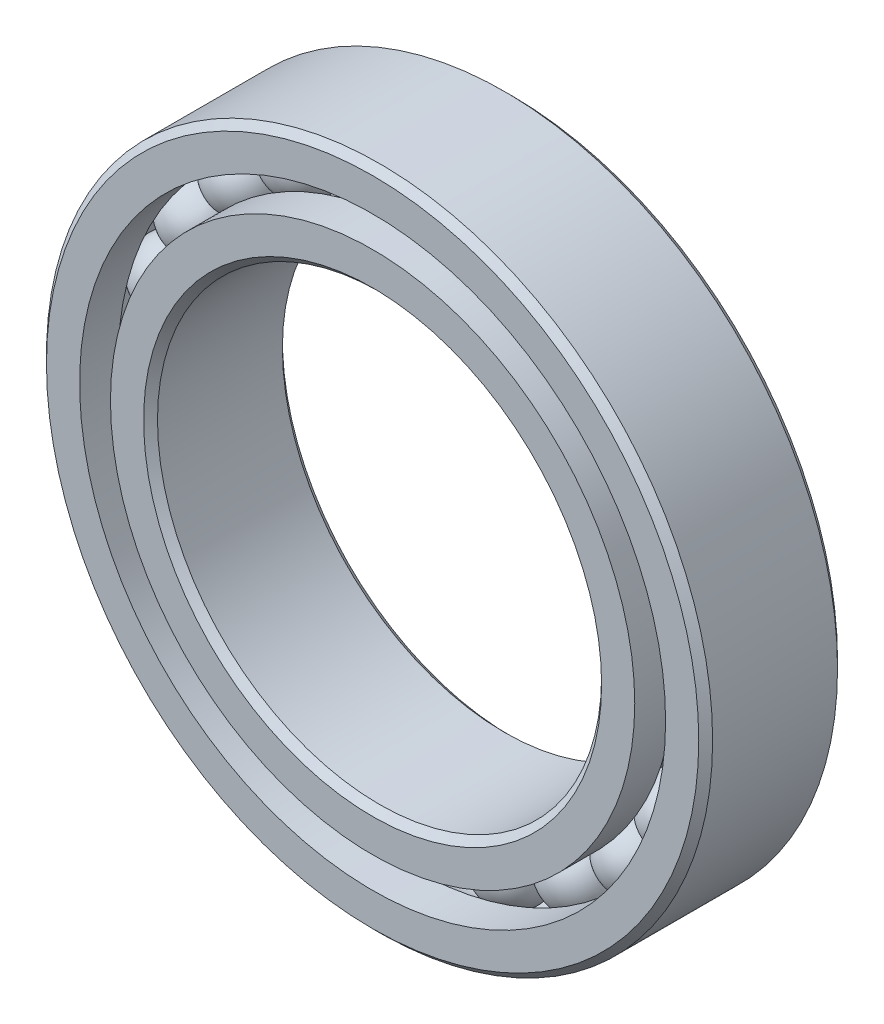
ISO-10303-21;
HEADER;
FILE_DESCRIPTION(('STEP AP214'),'2;1');
FILE_NAME('part.step','',(''),(''),'','','');
FILE_SCHEMA(('AUTOMOTIVE_DESIGN { 1 0 10303 214 1 1 1 1 }'));
ENDSEC;
DATA;
#1=APPLICATION_CONTEXT('core data for automotive mechanical design processes');
#2=APPLICATION_PROTOCOL_DEFINITION('international standard','automotive_design',2000,#1);
#3=PRODUCT_CONTEXT('',#1,'mechanical');
#4=PRODUCT('Part','Part','',(#3));
#5=PRODUCT_RELATED_PRODUCT_CATEGORY('part','',(#4));
#6=PRODUCT_DEFINITION_FORMATION('','',#4);
#7=PRODUCT_DEFINITION_CONTEXT('part definition',#1,'design');
#8=PRODUCT_DEFINITION('design','',#6,#7);
#9=PRODUCT_DEFINITION_SHAPE('','',#8);
#10=(LENGTH_UNIT() NAMED_UNIT(*) SI_UNIT(.MILLI.,.METRE.));
#11=(NAMED_UNIT(*) PLANE_ANGLE_UNIT() SI_UNIT($,.RADIAN.));
#12=(NAMED_UNIT(*) SI_UNIT($,.STERADIAN.) SOLID_ANGLE_UNIT());
#13=UNCERTAINTY_MEASURE_WITH_UNIT(LENGTH_MEASURE(1.E-05),#10,'distance_accuracy_value','');
#14=(GEOMETRIC_REPRESENTATION_CONTEXT(3) GLOBAL_UNCERTAINTY_ASSIGNED_CONTEXT((#13)) GLOBAL_UNIT_ASSIGNED_CONTEXT((#10,
#11,#12)) REPRESENTATION_CONTEXT('',''));
#15=CARTESIAN_POINT('',(0.,0.,0.));
#16=DIRECTION('',(0.,0.,1.));
#17=DIRECTION('',(1.,0.,0.));
#18=AXIS2_PLACEMENT_3D('',#15,#16,#17);
#19=CARTESIAN_POINT('',(-1.29409522551254,4.82962913144536,0.));
#20=DIRECTION('',(0.,0.,1.));
#21=DIRECTION('',(-0.258819045102508,0.965925826289072,0.));
#22=AXIS2_PLACEMENT_3D('',#19,#20,#21);
#23=SPHERICAL_SURFACE('',#22,0.621129993749942);
#24=CARTESIAN_POINT('',(-1.29409522551254,4.82962913144536,0.621129993749943));
#25=VERTEX_POINT('',#24);
#26=VERTEX_LOOP('',#25);
#27=FACE_BOUND('',#26,.T.);
#28=ADVANCED_FACE('F42',(#27),#23,.T.);
#29=CLOSED_SHELL('',(#28));
#30=MANIFOLD_SOLID_BREP('B2',#29);
#31=CARTESIAN_POINT('',(-2.49999999999994,4.33012701892223,0.));
#32=DIRECTION('',(0.,0.,1.));
#33=DIRECTION('',(-0.499999999999989,0.866025403784445,0.));
#34=AXIS2_PLACEMENT_3D('',#31,#32,#33);
#35=SPHERICAL_SURFACE('',#34,0.621129993749942);
#36=CARTESIAN_POINT('',(-2.49999999999994,4.33012701892223,0.621129993749943));
#37=VERTEX_POINT('',#36);
#38=VERTEX_LOOP('',#37);
#39=FACE_BOUND('',#38,.T.);
#40=ADVANCED_FACE('F59',(#39),#35,.T.);
#41=CLOSED_SHELL('',(#40));
#42=MANIFOLD_SOLID_BREP('B6',#41);
#43=CARTESIAN_POINT('',(-3.53553390593269,3.53553390593278,0.));
#44=DIRECTION('',(0.,0.,1.));
#45=DIRECTION('',(-0.707106781186539,0.707106781186556,0.));
#46=AXIS2_PLACEMENT_3D('',#43,#44,#45);
#47=SPHERICAL_SURFACE('',#46,0.621129993749942);
#48=CARTESIAN_POINT('',(-3.53553390593269,3.53553390593278,0.621129993749943));
#49=VERTEX_POINT('',#48);
#50=VERTEX_LOOP('',#49);
#51=FACE_BOUND('',#50,.T.);
#52=ADVANCED_FACE('F76',(#51),#47,.T.);
#53=CLOSED_SHELL('',(#52));
#54=MANIFOLD_SOLID_BREP('B38',#53);
#55=CARTESIAN_POINT('',(-4.33012701892216,2.50000000000005,0.));
#56=DIRECTION('',(0.,0.,1.));
#57=DIRECTION('',(-0.866025403784433,0.50000000000001,0.));
#58=AXIS2_PLACEMENT_3D('',#55,#56,#57);
#59=SPHERICAL_SURFACE('',#58,0.621129993749942);
#60=CARTESIAN_POINT('',(-4.33012701892216,2.50000000000005,0.621129993749943));
#61=VERTEX_POINT('',#60);
#62=VERTEX_LOOP('',#61);
#63=FACE_BOUND('',#62,.T.);
#64=ADVANCED_FACE('F93',(#63),#59,.T.);
#65=CLOSED_SHELL('',(#64));
#66=MANIFOLD_SOLID_BREP('B55',#65);
#67=CARTESIAN_POINT('',(-4.82962913144533,1.29409522551266,0.));
#68=DIRECTION('',(0.,0.,1.));
#69=DIRECTION('',(-0.965925826289065,0.258819045102531,0.));
#70=AXIS2_PLACEMENT_3D('',#67,#68,#69);
#71=SPHERICAL_SURFACE('',#70,0.621129993749942);
#72=CARTESIAN_POINT('',(-4.82962913144533,1.29409522551266,0.621129993749943));
#73=VERTEX_POINT('',#72);
#74=VERTEX_LOOP('',#73);
#75=FACE_BOUND('',#74,.T.);
#76=ADVANCED_FACE('F110',(#75),#71,.T.);
#77=CLOSED_SHELL('',(#76));
#78=MANIFOLD_SOLID_BREP('B72',#77);
#79=CARTESIAN_POINT('',(-5.,0.,0.));
#80=DIRECTION('',(0.,0.,1.));
#81=DIRECTION('',(-1.,0.,0.));
#82=AXIS2_PLACEMENT_3D('',#79,#80,#81);
#83=SPHERICAL_SURFACE('',#82,0.621129993749942);
#84=CARTESIAN_POINT('',(-5.,0.,0.621129993749943));
#85=VERTEX_POINT('',#84);
#86=VERTEX_LOOP('',#85);
#87=FACE_BOUND('',#86,.T.);
#88=ADVANCED_FACE('F127',(#87),#83,.T.);
#89=CLOSED_SHELL('',(#88));
#90=MANIFOLD_SOLID_BREP('B89',#89);
#91=CARTESIAN_POINT('',(-4.82962913144535,-1.29409522551256,0.));
#92=DIRECTION('',(0.,0.,1.));
#93=DIRECTION('',(-0.965925826289071,-0.258819045102511,0.));
#94=AXIS2_PLACEMENT_3D('',#91,#92,#93);
#95=SPHERICAL_SURFACE('',#94,0.621129993749942);
#96=CARTESIAN_POINT('',(-4.82962913144535,-1.29409522551256,0.621129993749943));
#97=VERTEX_POINT('',#96);
#98=VERTEX_LOOP('',#97);
#99=FACE_BOUND('',#98,.T.);
#100=ADVANCED_FACE('F144',(#99),#95,.T.);
#101=CLOSED_SHELL('',(#100));
#102=MANIFOLD_SOLID_BREP('B106',#101);
#103=CARTESIAN_POINT('',(-4.33012701892222,-2.49999999999996,0.));
#104=DIRECTION('',(0.,0.,1.));
#105=DIRECTION('',(-0.866025403784443,-0.499999999999992,0.));
#106=AXIS2_PLACEMENT_3D('',#103,#104,#105);
#107=SPHERICAL_SURFACE('',#106,0.621129993749942);
#108=CARTESIAN_POINT('',(-4.33012701892222,-2.49999999999996,0.621129993749943));
#109=VERTEX_POINT('',#108);
#110=VERTEX_LOOP('',#109);
#111=FACE_BOUND('',#110,.T.);
#112=ADVANCED_FACE('F161',(#111),#107,.T.);
#113=CLOSED_SHELL('',(#112));
#114=MANIFOLD_SOLID_BREP('B123',#113);
#115=CARTESIAN_POINT('',(-3.53553390593277,-3.53553390593271,0.));
#116=DIRECTION('',(0.,0.,1.));
#117=DIRECTION('',(-0.707106781186554,-0.707106781186541,0.));
#118=AXIS2_PLACEMENT_3D('',#115,#116,#117);
#119=SPHERICAL_SURFACE('',#118,0.621129993749942);
#120=CARTESIAN_POINT('',(-3.53553390593277,-3.53553390593271,0.621129993749943));
#121=VERTEX_POINT('',#120);
#122=VERTEX_LOOP('',#121);
#123=FACE_BOUND('',#122,.T.);
#124=ADVANCED_FACE('F178',(#123),#119,.T.);
#125=CLOSED_SHELL('',(#124));
#126=MANIFOLD_SOLID_BREP('B140',#125);
#127=CARTESIAN_POINT('',(-2.50000000000004,-4.33012701892217,0.));
#128=DIRECTION('',(0.,0.,1.));
#129=DIRECTION('',(-0.500000000000007,-0.866025403784435,0.));
#130=AXIS2_PLACEMENT_3D('',#127,#128,#129);
#131=SPHERICAL_SURFACE('',#130,0.621129993749942);
#132=CARTESIAN_POINT('',(-2.50000000000004,-4.33012701892217,0.621129993749943));
#133=VERTEX_POINT('',#132);
#134=VERTEX_LOOP('',#133);
#135=FACE_BOUND('',#134,.T.);
#136=ADVANCED_FACE('F213',(#135),#131,.T.);
#137=CLOSED_SHELL('',(#136));
#138=MANIFOLD_SOLID_BREP('B157',#137);
#139=CARTESIAN_POINT('',(-1.29409522551264,-4.82962913144533,0.));
#140=DIRECTION('',(0.,0.,1.));
#141=DIRECTION('',(-0.258819045102528,-0.965925826289066,0.));
#142=AXIS2_PLACEMENT_3D('',#139,#140,#141);
#143=SPHERICAL_SURFACE('',#142,0.621129993749942);
#144=CARTESIAN_POINT('',(-1.29409522551264,-4.82962913144533,0.621129993749943));
#145=VERTEX_POINT('',#144);
#146=VERTEX_LOOP('',#145);
#147=FACE_BOUND('',#146,.T.);
#148=ADVANCED_FACE('F248',(#147),#143,.T.);
#149=CLOSED_SHELL('',(#148));
#150=MANIFOLD_SOLID_BREP('B174',#149);
#151=CARTESIAN_POINT('',(0.,-5.,0.));
#152=DIRECTION('',(0.,0.,1.));
#153=DIRECTION('',(0.,-1.,0.));
#154=AXIS2_PLACEMENT_3D('',#151,#152,#153);
#155=SPHERICAL_SURFACE('',#154,0.621129993749942);
#156=CARTESIAN_POINT('',(0.,-5.,0.621129993749943));
#157=VERTEX_POINT('',#156);
#158=VERTEX_LOOP('',#157);
#159=FACE_BOUND('',#158,.T.);
#160=ADVANCED_FACE('F283',(#159),#155,.T.);
#161=CLOSED_SHELL('',(#160));
#162=MANIFOLD_SOLID_BREP('B209',#161);
#163=CARTESIAN_POINT('',(1.29409522551257,-4.82962913144535,0.));
#164=DIRECTION('',(0.,0.,1.));
#165=DIRECTION('',(0.258819045102515,-0.96592582628907,0.));
#166=AXIS2_PLACEMENT_3D('',#163,#164,#165);
#167=SPHERICAL_SURFACE('',#166,0.621129993749942);
#168=CARTESIAN_POINT('',(1.29409522551257,-4.82962913144535,0.621129993749943));
#169=VERTEX_POINT('',#168);
#170=VERTEX_LOOP('',#169);
#171=FACE_BOUND('',#170,.T.);
#172=ADVANCED_FACE('F318',(#171),#167,.T.);
#173=CLOSED_SHELL('',(#172));
#174=MANIFOLD_SOLID_BREP('B244',#173);
#175=CARTESIAN_POINT('',(2.49999999999997,-4.33012701892221,0.));
#176=DIRECTION('',(0.,0.,1.));
#177=DIRECTION('',(0.499999999999995,-0.866025403784442,0.));
#178=AXIS2_PLACEMENT_3D('',#175,#176,#177);
#179=SPHERICAL_SURFACE('',#178,0.621129993749942);
#180=CARTESIAN_POINT('',(2.49999999999997,-4.33012701892221,0.621129993749943));
#181=VERTEX_POINT('',#180);
#182=VERTEX_LOOP('',#181);
#183=FACE_BOUND('',#182,.T.);
#184=ADVANCED_FACE('F353',(#183),#179,.T.);
#185=CLOSED_SHELL('',(#184));
#186=MANIFOLD_SOLID_BREP('B279',#185);
#187=CARTESIAN_POINT('',(3.53553390593272,-3.53553390593276,0.));
#188=DIRECTION('',(0.,0.,1.));
#189=DIRECTION('',(0.707106781186544,-0.707106781186551,0.));
#190=AXIS2_PLACEMENT_3D('',#187,#188,#189);
#191=SPHERICAL_SURFACE('',#190,0.621129993749942);
#192=CARTESIAN_POINT('',(3.53553390593272,-3.53553390593276,0.621129993749943));
#193=VERTEX_POINT('',#192);
#194=VERTEX_LOOP('',#193);
#195=FACE_BOUND('',#194,.T.);
#196=ADVANCED_FACE('F388',(#195),#191,.T.);
#197=CLOSED_SHELL('',(#196));
#198=MANIFOLD_SOLID_BREP('B314',#197);
#199=CARTESIAN_POINT('',(4.33012701892218,-2.50000000000002,0.));
#200=DIRECTION('',(0.,0.,1.));
#201=DIRECTION('',(0.866025403784436,-0.500000000000004,0.));
#202=AXIS2_PLACEMENT_3D('',#199,#200,#201);
#203=SPHERICAL_SURFACE('',#202,0.621129993749942);
#204=CARTESIAN_POINT('',(4.33012701892218,-2.50000000000002,0.621129993749943));
#205=VERTEX_POINT('',#204);
#206=VERTEX_LOOP('',#205);
#207=FACE_BOUND('',#206,.T.);
#208=ADVANCED_FACE('F423',(#207),#203,.T.);
#209=CLOSED_SHELL('',(#208));
#210=MANIFOLD_SOLID_BREP('B349',#209);
#211=CARTESIAN_POINT('',(4.82962913144534,-1.29409522551262,0.));
#212=DIRECTION('',(0.,0.,1.));
#213=DIRECTION('',(0.965925826289067,-0.258819045102525,0.));
#214=AXIS2_PLACEMENT_3D('',#211,#212,#213);
#215=SPHERICAL_SURFACE('',#214,0.621129993749942);
#216=CARTESIAN_POINT('',(4.82962913144534,-1.29409522551262,0.621129993749943));
#217=VERTEX_POINT('',#216);
#218=VERTEX_LOOP('',#217);
#219=FACE_BOUND('',#218,.T.);
#220=ADVANCED_FACE('F458',(#219),#215,.T.);
#221=CLOSED_SHELL('',(#220));
#222=MANIFOLD_SOLID_BREP('B384',#221);
#223=CARTESIAN_POINT('',(5.,0.,0.));
#224=DIRECTION('',(0.,0.,1.));
#225=DIRECTION('',(1.,0.,0.));
#226=AXIS2_PLACEMENT_3D('',#223,#224,#225);
#227=SPHERICAL_SURFACE('',#226,0.621129993749942);
#228=CARTESIAN_POINT('',(5.,0.,0.621129993749943));
#229=VERTEX_POINT('',#228);
#230=VERTEX_LOOP('',#229);
#231=FACE_BOUND('',#230,.T.);
#232=ADVANCED_FACE('F493',(#231),#227,.T.);
#233=CLOSED_SHELL('',(#232));
#234=MANIFOLD_SOLID_BREP('B419',#233);
#235=CARTESIAN_POINT('',(4.82962913144535,1.29409522551259,0.));
#236=DIRECTION('',(0.,0.,1.));
#237=DIRECTION('',(0.965925826289069,0.258819045102518,0.));
#238=AXIS2_PLACEMENT_3D('',#235,#236,#237);
#239=SPHERICAL_SURFACE('',#238,0.621129993749942);
#240=CARTESIAN_POINT('',(4.82962913144535,1.29409522551259,0.621129993749943));
#241=VERTEX_POINT('',#240);
#242=VERTEX_LOOP('',#241);
#243=FACE_BOUND('',#242,.T.);
#244=ADVANCED_FACE('F528',(#243),#239,.T.);
#245=CLOSED_SHELL('',(#244));
#246=MANIFOLD_SOLID_BREP('B454',#245);
#247=CARTESIAN_POINT('',(4.3301270189222,2.49999999999999,0.));
#248=DIRECTION('',(0.,0.,1.));
#249=DIRECTION('',(0.86602540378444,0.499999999999998,0.));
#250=AXIS2_PLACEMENT_3D('',#247,#248,#249);
#251=SPHERICAL_SURFACE('',#250,0.621129993749942);
#252=CARTESIAN_POINT('',(4.3301270189222,2.49999999999999,0.621129993749943));
#253=VERTEX_POINT('',#252);
#254=VERTEX_LOOP('',#253);
#255=FACE_BOUND('',#254,.T.);
#256=ADVANCED_FACE('F563',(#255),#251,.T.);
#257=CLOSED_SHELL('',(#256));
#258=MANIFOLD_SOLID_BREP('B489',#257);
#259=CARTESIAN_POINT('',(3.53553390593274,3.53553390593273,0.));
#260=DIRECTION('',(0.,0.,1.));
#261=DIRECTION('',(0.707106781186549,0.707106781186546,0.));
#262=AXIS2_PLACEMENT_3D('',#259,#260,#261);
#263=SPHERICAL_SURFACE('',#262,0.621129993749942);
#264=CARTESIAN_POINT('',(3.53553390593274,3.53553390593273,0.621129993749943));
#265=VERTEX_POINT('',#264);
#266=VERTEX_LOOP('',#265);
#267=FACE_BOUND('',#266,.T.);
#268=ADVANCED_FACE('F598',(#267),#263,.T.);
#269=CLOSED_SHELL('',(#268));
#270=MANIFOLD_SOLID_BREP('B524',#269);
#271=CARTESIAN_POINT('',(2.50000000000001,4.33012701892219,0.));
#272=DIRECTION('',(0.,0.,1.));
#273=DIRECTION('',(0.500000000000001,0.866025403784438,0.));
#274=AXIS2_PLACEMENT_3D('',#271,#272,#273);
#275=SPHERICAL_SURFACE('',#274,0.621129993749942);
#276=CARTESIAN_POINT('',(2.50000000000001,4.33012701892219,0.621129993749943));
#277=VERTEX_POINT('',#276);
#278=VERTEX_LOOP('',#277);
#279=FACE_BOUND('',#278,.T.);
#280=ADVANCED_FACE('F633',(#279),#275,.T.);
#281=CLOSED_SHELL('',(#280));
#282=MANIFOLD_SOLID_BREP('B559',#281);
#283=CARTESIAN_POINT('',(1.29409522551261,4.82962913144534,0.));
#284=DIRECTION('',(0.,0.,1.));
#285=DIRECTION('',(0.258819045102521,0.965925826289068,0.));
#286=AXIS2_PLACEMENT_3D('',#283,#284,#285);
#287=SPHERICAL_SURFACE('',#286,0.621129993749942);
#288=CARTESIAN_POINT('',(1.29409522551261,4.82962913144534,0.621129993749943));
#289=VERTEX_POINT('',#288);
#290=VERTEX_LOOP('',#289);
#291=FACE_BOUND('',#290,.T.);
#292=ADVANCED_FACE('F668',(#291),#287,.T.);
#293=CLOSED_SHELL('',(#292));
#294=MANIFOLD_SOLID_BREP('B594',#293);
#295=CARTESIAN_POINT('',(0.,5.,0.));
#296=DIRECTION('',(0.,0.,1.));
#297=DIRECTION('',(0.,1.,0.));
#298=AXIS2_PLACEMENT_3D('',#295,#296,#297);
#299=SPHERICAL_SURFACE('',#298,0.621129993749942);
#300=CARTESIAN_POINT('',(0.,5.,0.621129993749943));
#301=VERTEX_POINT('',#300);
#302=VERTEX_LOOP('',#301);
#303=FACE_BOUND('',#302,.T.);
#304=ADVANCED_FACE('F705',(#303),#299,.T.);
#305=CLOSED_SHELL('',(#304));
#306=MANIFOLD_SOLID_BREP('B629',#305);
#307=CARTESIAN_POINT('',(0.,0.,1.125));
#308=DIRECTION('',(0.,0.,-1.));
#309=DIRECTION('',(-1.,0.,0.));
#310=AXIS2_PLACEMENT_3D('',#307,#308,#309);
#311=CONICAL_SURFACE('',#310,6.,0.785398163397442);
#312=CARTESIAN_POINT('',(0.,0.,1.25));
#313=DIRECTION('',(0.,0.,1.));
#314=DIRECTION('',(1.,0.,0.));
#315=AXIS2_PLACEMENT_3D('',#312,#313,#314);
#316=CIRCLE('',#315,5.875);
#317=CARTESIAN_POINT('',(5.875,0.,1.25));
#318=VERTEX_POINT('',#317);
#319=EDGE_CURVE('E751',#318,#318,#316,.T.);
#320=ORIENTED_EDGE('',*,*,#319,.F.);
#321=EDGE_LOOP('',(#320));
#322=FACE_BOUND('',#321,.T.);
#323=CARTESIAN_POINT('',(0.,0.,1.125));
#324=DIRECTION('',(0.,0.,1.));
#325=DIRECTION('',(1.,0.,0.));
#326=AXIS2_PLACEMENT_3D('',#323,#324,#325);
#327=CIRCLE('',#326,6.);
#328=CARTESIAN_POINT('',(6.,0.,1.125));
#329=VERTEX_POINT('',#328);
#330=EDGE_CURVE('E704',#329,#329,#327,.T.);
#331=ORIENTED_EDGE('',*,*,#330,.T.);
#332=EDGE_LOOP('',(#331));
#333=FACE_BOUND('',#332,.T.);
#334=ADVANCED_FACE('F723',(#322,#333),#311,.T.);
#335=CARTESIAN_POINT('',(0.,0.,1.25));
#336=DIRECTION('',(0.,0.,1.));
#337=DIRECTION('',(1.,0.,0.));
#338=AXIS2_PLACEMENT_3D('',#335,#336,#337);
#339=CYLINDRICAL_SURFACE('',#338,6.);
#340=ORIENTED_EDGE('',*,*,#330,.F.);
#341=EDGE_LOOP('',(#340));
#342=FACE_BOUND('',#341,.T.);
#343=CARTESIAN_POINT('',(0.,0.,-1.125));
#344=DIRECTION('',(0.,0.,1.));
#345=DIRECTION('',(1.,0.,0.));
#346=AXIS2_PLACEMENT_3D('',#343,#344,#345);
#347=CIRCLE('',#346,6.);
#348=CARTESIAN_POINT('',(6.,0.,-1.125));
#349=VERTEX_POINT('',#348);
#350=EDGE_CURVE('E729',#349,#349,#347,.T.);
#351=ORIENTED_EDGE('',*,*,#350,.T.);
#352=EDGE_LOOP('',(#351));
#353=FACE_BOUND('',#352,.T.);
#354=ADVANCED_FACE('F758',(#342,#353),#339,.T.);
#355=CARTESIAN_POINT('',(0.,0.,-1.25));
#356=DIRECTION('',(0.,0.,1.));
#357=DIRECTION('',(1.,0.,0.));
#358=AXIS2_PLACEMENT_3D('',#355,#356,#357);
#359=CONICAL_SURFACE('',#358,5.875,0.785398163397442);
#360=ORIENTED_EDGE('',*,*,#350,.F.);
#361=EDGE_LOOP('',(#360));
#362=FACE_BOUND('',#361,.T.);
#363=CARTESIAN_POINT('',(0.,0.,-1.25));
#364=DIRECTION('',(0.,0.,1.));
#365=DIRECTION('',(1.,0.,0.));
#366=AXIS2_PLACEMENT_3D('',#363,#364,#365);
#367=CIRCLE('',#366,5.875);
#368=CARTESIAN_POINT('',(5.875,0.,-1.25));
#369=VERTEX_POINT('',#368);
#370=EDGE_CURVE('E733',#369,#369,#367,.T.);
#371=ORIENTED_EDGE('',*,*,#370,.T.);
#372=EDGE_LOOP('',(#371));
#373=FACE_BOUND('',#372,.T.);
#374=ADVANCED_FACE('F762',(#362,#373),#359,.T.);
#375=CARTESIAN_POINT('',(0.,5.875,-1.25));
#376=DIRECTION('',(0.,0.,1.));
#377=DIRECTION('',(1.,0.,0.));
#378=AXIS2_PLACEMENT_3D('',#375,#376,#377);
#379=PLANE('',#378);
#380=ORIENTED_EDGE('',*,*,#370,.F.);
#381=EDGE_LOOP('',(#380));
#382=FACE_BOUND('',#381,.T.);
#383=CARTESIAN_POINT('',(0.,0.,-1.25));
#384=DIRECTION('',(0.,0.,1.));
#385=DIRECTION('',(1.,0.,0.));
#386=AXIS2_PLACEMENT_3D('',#383,#384,#385);
#387=CIRCLE('',#386,5.27777777777778);
#388=CARTESIAN_POINT('',(5.27777777777778,0.,-1.25));
#389=VERTEX_POINT('',#388);
#390=EDGE_CURVE('E737',#389,#389,#387,.T.);
#391=ORIENTED_EDGE('',*,*,#390,.T.);
#392=EDGE_LOOP('',(#391));
#393=FACE_BOUND('',#392,.T.);
#394=ADVANCED_FACE('F767',(#382,#393),#379,.F.);
#395=CARTESIAN_POINT('',(0.,0.,1.25));
#396=DIRECTION('',(0.,0.,1.));
#397=DIRECTION('',(1.,0.,0.));
#398=AXIS2_PLACEMENT_3D('',#395,#396,#397);
#399=CYLINDRICAL_SURFACE('',#398,5.27777777777778);
#400=ORIENTED_EDGE('',*,*,#390,.F.);
#401=EDGE_LOOP('',(#400));
#402=FACE_BOUND('',#401,.T.);
#403=CARTESIAN_POINT('',(0.,0.,-0.555555555555555));
#404=DIRECTION('',(0.,0.,1.));
#405=DIRECTION('',(1.,0.,0.));
#406=AXIS2_PLACEMENT_3D('',#403,#404,#405);
#407=CIRCLE('',#406,5.27777777777778);
#408=CARTESIAN_POINT('',(5.27777777777778,0.,-0.555555555555555));
#409=VERTEX_POINT('',#408);
#410=EDGE_CURVE('E742',#409,#409,#407,.T.);
#411=ORIENTED_EDGE('',*,*,#410,.T.);
#412=EDGE_LOOP('',(#411));
#413=FACE_BOUND('',#412,.T.);
#414=ADVANCED_FACE('F773',(#402,#413),#399,.F.);
#415=CARTESIAN_POINT('',(0.,0.,0.));
#416=DIRECTION('',(0.,0.,1.));
#417=DIRECTION('',(1.,0.,0.));
#418=AXIS2_PLACEMENT_3D('',#415,#416,#417);
#419=TOROIDAL_SURFACE('',#418,5.,0.62112999374994);
#420=ORIENTED_EDGE('',*,*,#410,.F.);
#421=EDGE_LOOP('',(#420));
#422=FACE_BOUND('',#421,.T.);
#423=CARTESIAN_POINT('',(0.,0.,0.555555555555556));
#424=DIRECTION('',(0.,0.,1.));
#425=DIRECTION('',(1.,0.,0.));
#426=AXIS2_PLACEMENT_3D('',#423,#424,#425);
#427=CIRCLE('',#426,5.27777777777778);
#428=CARTESIAN_POINT('',(5.27777777777778,0.,0.555555555555556));
#429=VERTEX_POINT('',#428);
#430=EDGE_CURVE('E745',#429,#429,#427,.T.);
#431=ORIENTED_EDGE('',*,*,#430,.T.);
#432=EDGE_LOOP('',(#431));
#433=FACE_BOUND('',#432,.T.);
#434=ADVANCED_FACE('F777',(#422,#433),#419,.F.);
#435=CARTESIAN_POINT('',(0.,0.,1.25));
#436=DIRECTION('',(0.,0.,1.));
#437=DIRECTION('',(1.,0.,0.));
#438=AXIS2_PLACEMENT_3D('',#435,#436,#437);
#439=CYLINDRICAL_SURFACE('',#438,5.27777777777778);
#440=ORIENTED_EDGE('',*,*,#430,.F.);
#441=EDGE_LOOP('',(#440));
#442=FACE_BOUND('',#441,.T.);
#443=CARTESIAN_POINT('',(0.,0.,1.25));
#444=DIRECTION('',(0.,0.,1.));
#445=DIRECTION('',(1.,0.,0.));
#446=AXIS2_PLACEMENT_3D('',#443,#444,#445);
#447=CIRCLE('',#446,5.27777777777778);
#448=CARTESIAN_POINT('',(5.27777777777778,0.,1.25));
#449=VERTEX_POINT('',#448);
#450=EDGE_CURVE('E748',#449,#449,#447,.T.);
#451=ORIENTED_EDGE('',*,*,#450,.T.);
#452=EDGE_LOOP('',(#451));
#453=FACE_BOUND('',#452,.T.);
#454=ADVANCED_FACE('F781',(#442,#453),#439,.F.);
#455=CARTESIAN_POINT('',(0.,5.875,1.25));
#456=DIRECTION('',(0.,0.,-1.));
#457=DIRECTION('',(-1.,0.,0.));
#458=AXIS2_PLACEMENT_3D('',#455,#456,#457);
#459=PLANE('',#458);
#460=ORIENTED_EDGE('',*,*,#450,.F.);
#461=EDGE_LOOP('',(#460));
#462=FACE_BOUND('',#461,.T.);
#463=ORIENTED_EDGE('',*,*,#319,.T.);
#464=EDGE_LOOP('',(#463));
#465=FACE_BOUND('',#464,.T.);
#466=ADVANCED_FACE('F755',(#462,#465),#459,.F.);
#467=CLOSED_SHELL('',(#334,#354,#374,#394,#414,#434,#454,#466));
#468=MANIFOLD_SOLID_BREP('B664',#467);
#469=CARTESIAN_POINT('',(0.,4.72222222222222,1.25));
#470=DIRECTION('',(0.,0.,-1.));
#471=DIRECTION('',(-1.,0.,0.));
#472=AXIS2_PLACEMENT_3D('',#469,#470,#471);
#473=PLANE('',#472);
#474=CARTESIAN_POINT('',(0.,0.,1.25));
#475=DIRECTION('',(0.,0.,1.));
#476=DIRECTION('',(1.,0.,0.));
#477=AXIS2_PLACEMENT_3D('',#474,#475,#476);
#478=CIRCLE('',#477,4.125);
#479=CARTESIAN_POINT('',(4.125,0.,1.25));
#480=VERTEX_POINT('',#479);
#481=EDGE_CURVE('E722',#480,#480,#478,.T.);
#482=ORIENTED_EDGE('',*,*,#481,.F.);
#483=EDGE_LOOP('',(#482));
#484=FACE_BOUND('',#483,.T.);
#485=CARTESIAN_POINT('',(0.,0.,1.25));
#486=DIRECTION('',(0.,0.,1.));
#487=DIRECTION('',(1.,0.,0.));
#488=AXIS2_PLACEMENT_3D('',#485,#486,#487);
#489=CIRCLE('',#488,4.72222222222222);
#490=CARTESIAN_POINT('',(4.72222222222222,0.,1.25));
#491=VERTEX_POINT('',#490);
#492=EDGE_CURVE('E857',#491,#491,#489,.T.);
#493=ORIENTED_EDGE('',*,*,#492,.T.);
#494=EDGE_LOOP('',(#493));
#495=FACE_BOUND('',#494,.T.);
#496=ADVANCED_FACE('F829',(#484,#495),#473,.F.);
#497=CARTESIAN_POINT('',(0.,0.,1.25));
#498=DIRECTION('',(0.,0.,1.));
#499=DIRECTION('',(1.,0.,0.));
#500=AXIS2_PLACEMENT_3D('',#497,#498,#499);
#501=CONICAL_SURFACE('',#500,4.125,0.785398163397444);
#502=CARTESIAN_POINT('',(0.,0.,1.125));
#503=DIRECTION('',(0.,0.,1.));
#504=DIRECTION('',(1.,0.,0.));
#505=AXIS2_PLACEMENT_3D('',#502,#503,#504);
#506=CIRCLE('',#505,4.);
#507=CARTESIAN_POINT('',(4.,0.,1.125));
#508=VERTEX_POINT('',#507);
#509=EDGE_CURVE('E835',#508,#508,#506,.T.);
#510=ORIENTED_EDGE('',*,*,#509,.F.);
#511=EDGE_LOOP('',(#510));
#512=FACE_BOUND('',#511,.T.);
#513=ORIENTED_EDGE('',*,*,#481,.T.);
#514=EDGE_LOOP('',(#513));
#515=FACE_BOUND('',#514,.T.);
#516=ADVANCED_FACE('F894',(#512,#515),#501,.F.);
#517=CARTESIAN_POINT('',(0.,0.,1.25));
#518=DIRECTION('',(0.,0.,1.));
#519=DIRECTION('',(1.,0.,0.));
#520=AXIS2_PLACEMENT_3D('',#517,#518,#519);
#521=CYLINDRICAL_SURFACE('',#520,4.);
#522=CARTESIAN_POINT('',(0.,0.,-1.125));
#523=DIRECTION('',(0.,0.,1.));
#524=DIRECTION('',(1.,0.,0.));
#525=AXIS2_PLACEMENT_3D('',#522,#523,#524);
#526=CIRCLE('',#525,4.);
#527=CARTESIAN_POINT('',(4.,0.,-1.125));
#528=VERTEX_POINT('',#527);
#529=EDGE_CURVE('E839',#528,#528,#526,.T.);
#530=ORIENTED_EDGE('',*,*,#529,.F.);
#531=EDGE_LOOP('',(#530));
#532=FACE_BOUND('',#531,.T.);
#533=ORIENTED_EDGE('',*,*,#509,.T.);
#534=EDGE_LOOP('',(#533));
#535=FACE_BOUND('',#534,.T.);
#536=ADVANCED_FACE('F889',(#532,#535),#521,.F.);
#537=CARTESIAN_POINT('',(0.,0.,-1.125));
#538=DIRECTION('',(0.,0.,-1.));
#539=DIRECTION('',(-1.,0.,0.));
#540=AXIS2_PLACEMENT_3D('',#537,#538,#539);
#541=CONICAL_SURFACE('',#540,4.,0.785398163397445);
#542=CARTESIAN_POINT('',(0.,0.,-1.25));
#543=DIRECTION('',(0.,0.,1.));
#544=DIRECTION('',(1.,0.,0.));
#545=AXIS2_PLACEMENT_3D('',#542,#543,#544);
#546=CIRCLE('',#545,4.125);
#547=CARTESIAN_POINT('',(4.125,0.,-1.25));
#548=VERTEX_POINT('',#547);
#549=EDGE_CURVE('E843',#548,#548,#546,.T.);
#550=ORIENTED_EDGE('',*,*,#549,.F.);
#551=EDGE_LOOP('',(#550));
#552=FACE_BOUND('',#551,.T.);
#553=ORIENTED_EDGE('',*,*,#529,.T.);
#554=EDGE_LOOP('',(#553));
#555=FACE_BOUND('',#554,.T.);
#556=ADVANCED_FACE('F883',(#552,#555),#541,.F.);
#557=CARTESIAN_POINT('',(0.,4.72222222222222,-1.25));
#558=DIRECTION('',(0.,0.,1.));
#559=DIRECTION('',(1.,0.,0.));
#560=AXIS2_PLACEMENT_3D('',#557,#558,#559);
#561=PLANE('',#560);
#562=CARTESIAN_POINT('',(0.,0.,-1.25));
#563=DIRECTION('',(0.,0.,1.));
#564=DIRECTION('',(1.,0.,0.));
#565=AXIS2_PLACEMENT_3D('',#562,#563,#564);
#566=CIRCLE('',#565,4.72222222222222);
#567=CARTESIAN_POINT('',(4.72222222222222,0.,-1.25));
#568=VERTEX_POINT('',#567);
#569=EDGE_CURVE('E848',#568,#568,#566,.T.);
#570=ORIENTED_EDGE('',*,*,#569,.F.);
#571=EDGE_LOOP('',(#570));
#572=FACE_BOUND('',#571,.T.);
#573=ORIENTED_EDGE('',*,*,#549,.T.);
#574=EDGE_LOOP('',(#573));
#575=FACE_BOUND('',#574,.T.);
#576=ADVANCED_FACE('F877',(#572,#575),#561,.F.);
#577=CARTESIAN_POINT('',(0.,0.,1.25));
#578=DIRECTION('',(0.,0.,1.));
#579=DIRECTION('',(1.,0.,0.));
#580=AXIS2_PLACEMENT_3D('',#577,#578,#579);
#581=CYLINDRICAL_SURFACE('',#580,4.72222222222222);
#582=CARTESIAN_POINT('',(0.,0.,-0.555555555555555));
#583=DIRECTION('',(0.,0.,1.));
#584=DIRECTION('',(1.,0.,0.));
#585=AXIS2_PLACEMENT_3D('',#582,#583,#584);
#586=CIRCLE('',#585,4.72222222222222);
#587=CARTESIAN_POINT('',(4.72222222222222,0.,-0.555555555555555));
#588=VERTEX_POINT('',#587);
#589=EDGE_CURVE('E851',#588,#588,#586,.T.);
#590=ORIENTED_EDGE('',*,*,#589,.F.);
#591=EDGE_LOOP('',(#590));
#592=FACE_BOUND('',#591,.T.);
#593=ORIENTED_EDGE('',*,*,#569,.T.);
#594=EDGE_LOOP('',(#593));
#595=FACE_BOUND('',#594,.T.);
#596=ADVANCED_FACE('F871',(#592,#595),#581,.T.);
#597=CARTESIAN_POINT('',(0.,0.,0.));
#598=DIRECTION('',(0.,0.,1.));
#599=DIRECTION('',(1.,0.,0.));
#600=AXIS2_PLACEMENT_3D('',#597,#598,#599);
#601=TOROIDAL_SURFACE('',#600,5.,0.621129993749942);
#602=CARTESIAN_POINT('',(0.,0.,0.555555555555556));
#603=DIRECTION('',(0.,0.,1.));
#604=DIRECTION('',(1.,0.,0.));
#605=AXIS2_PLACEMENT_3D('',#602,#603,#604);
#606=CIRCLE('',#605,4.72222222222222);
#607=CARTESIAN_POINT('',(4.72222222222222,0.,0.555555555555556));
#608=VERTEX_POINT('',#607);
#609=EDGE_CURVE('E854',#608,#608,#606,.T.);
#610=ORIENTED_EDGE('',*,*,#609,.F.);
#611=EDGE_LOOP('',(#610));
#612=FACE_BOUND('',#611,.T.);
#613=ORIENTED_EDGE('',*,*,#589,.T.);
#614=EDGE_LOOP('',(#613));
#615=FACE_BOUND('',#614,.T.);
#616=ADVANCED_FACE('F865',(#612,#615),#601,.F.);
#617=CARTESIAN_POINT('',(0.,0.,1.25));
#618=DIRECTION('',(0.,0.,1.));
#619=DIRECTION('',(1.,0.,0.));
#620=AXIS2_PLACEMENT_3D('',#617,#618,#619);
#621=CYLINDRICAL_SURFACE('',#620,4.72222222222222);
#622=ORIENTED_EDGE('',*,*,#492,.F.);
#623=EDGE_LOOP('',(#622));
#624=FACE_BOUND('',#623,.T.);
#625=ORIENTED_EDGE('',*,*,#609,.T.);
#626=EDGE_LOOP('',(#625));
#627=FACE_BOUND('',#626,.T.);
#628=ADVANCED_FACE('F862',(#624,#627),#621,.T.);
#629=CLOSED_SHELL('',(#496,#516,#536,#556,#576,#596,#616,#628));
#630=MANIFOLD_SOLID_BREP('B699',#629);
#631=ADVANCED_BREP_SHAPE_REPRESENTATION('',(#18,#30,#42,#54,#66,#78,#90,#102,#114,#126,#138,
#150,#162,#174,#186,#198,#210,#222,#234,#246,#258,#270,#282,#294,#306,#468,#630),#14);
#632=SHAPE_DEFINITION_REPRESENTATION(#9,#631);
ENDSEC;
END-ISO-10303-21;
